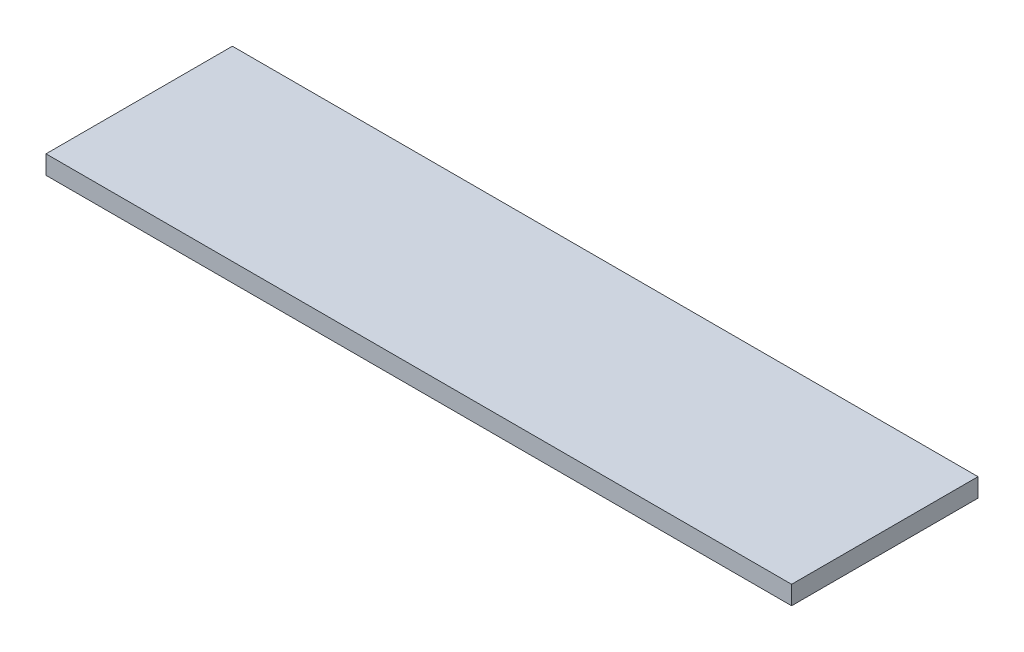
ISO-10303-21;
HEADER;
FILE_DESCRIPTION(('STEP AP214'),'2;1');
FILE_NAME('part.step','',(''),(''),'','','');
FILE_SCHEMA(('AUTOMOTIVE_DESIGN { 1 0 10303 214 1 1 1 1 }'));
ENDSEC;
DATA;
#1=APPLICATION_CONTEXT('core data for automotive mechanical design processes');
#2=APPLICATION_PROTOCOL_DEFINITION('international standard','automotive_design',2000,#1);
#3=PRODUCT_CONTEXT('',#1,'mechanical');
#4=PRODUCT('Part','Part','',(#3));
#5=PRODUCT_RELATED_PRODUCT_CATEGORY('part','',(#4));
#6=PRODUCT_DEFINITION_FORMATION('','',#4);
#7=PRODUCT_DEFINITION_CONTEXT('part definition',#1,'design');
#8=PRODUCT_DEFINITION('design','',#6,#7);
#9=PRODUCT_DEFINITION_SHAPE('','',#8);
#10=(LENGTH_UNIT() NAMED_UNIT(*) SI_UNIT(.MILLI.,.METRE.));
#11=(NAMED_UNIT(*) PLANE_ANGLE_UNIT() SI_UNIT($,.RADIAN.));
#12=(NAMED_UNIT(*) SI_UNIT($,.STERADIAN.) SOLID_ANGLE_UNIT());
#13=UNCERTAINTY_MEASURE_WITH_UNIT(LENGTH_MEASURE(1.E-05),#10,'distance_accuracy_value','');
#14=(GEOMETRIC_REPRESENTATION_CONTEXT(3) GLOBAL_UNCERTAINTY_ASSIGNED_CONTEXT((#13)) GLOBAL_UNIT_ASSIGNED_CONTEXT((#10,
#11,#12)) REPRESENTATION_CONTEXT('',''));
#15=CARTESIAN_POINT('',(0.,0.,0.));
#16=DIRECTION('',(0.,0.,1.));
#17=DIRECTION('',(1.,0.,0.));
#18=AXIS2_PLACEMENT_3D('',#15,#16,#17);
#19=CARTESIAN_POINT('',(200.,10.,-50.));
#20=DIRECTION('',(-1.,0.,0.));
#21=DIRECTION('',(0.,0.,1.));
#22=AXIS2_PLACEMENT_3D('',#19,#20,#21);
#23=PLANE('',#22);
#24=DIRECTION('',(0.,0.,-1.));
#25=VECTOR('',#24,1.);
#26=CARTESIAN_POINT('',(200.,0.,-50.));
#27=LINE('',#26,#25);
#28=CARTESIAN_POINT('',(200.,0.,50.));
#29=VERTEX_POINT('',#28);
#30=CARTESIAN_POINT('',(200.,0.,-50.));
#31=VERTEX_POINT('',#30);
#32=EDGE_CURVE('E107',#29,#31,#27,.T.);
#33=ORIENTED_EDGE('',*,*,#32,.T.);
#34=DIRECTION('',(0.,-1.,0.));
#35=VECTOR('',#34,1.);
#36=CARTESIAN_POINT('',(200.,10.,-50.));
#37=LINE('',#36,#35);
#38=CARTESIAN_POINT('',(200.,10.,-50.));
#39=VERTEX_POINT('',#38);
#40=EDGE_CURVE('E11',#39,#31,#37,.T.);
#41=ORIENTED_EDGE('',*,*,#40,.F.);
#42=DIRECTION('',(0.,0.,-1.));
#43=VECTOR('',#42,1.);
#44=CARTESIAN_POINT('',(200.,10.,-50.));
#45=LINE('',#44,#43);
#46=CARTESIAN_POINT('',(200.,10.,50.));
#47=VERTEX_POINT('',#46);
#48=EDGE_CURVE('E91',#47,#39,#45,.T.);
#49=ORIENTED_EDGE('',*,*,#48,.F.);
#50=DIRECTION('',(0.,-1.,0.));
#51=VECTOR('',#50,1.);
#52=CARTESIAN_POINT('',(200.,10.,50.));
#53=LINE('',#52,#51);
#54=EDGE_CURVE('E103',#47,#29,#53,.T.);
#55=ORIENTED_EDGE('',*,*,#54,.T.);
#56=EDGE_LOOP('',(#33,#41,#49,#55));
#57=FACE_BOUND('',#56,.T.);
#58=ADVANCED_FACE('F39',(#57),#23,.F.);
#59=CARTESIAN_POINT('',(-200.,10.,-50.));
#60=DIRECTION('',(0.,0.,1.));
#61=DIRECTION('',(1.,0.,0.));
#62=AXIS2_PLACEMENT_3D('',#59,#60,#61);
#63=PLANE('',#62);
#64=DIRECTION('',(-1.,0.,0.));
#65=VECTOR('',#64,1.);
#66=CARTESIAN_POINT('',(-200.,0.,-50.));
#67=LINE('',#66,#65);
#68=CARTESIAN_POINT('',(-200.,0.,-50.));
#69=VERTEX_POINT('',#68);
#70=EDGE_CURVE('E96',#31,#69,#67,.T.);
#71=ORIENTED_EDGE('',*,*,#70,.T.);
#72=DIRECTION('',(0.,-1.,0.));
#73=VECTOR('',#72,1.);
#74=CARTESIAN_POINT('',(-200.,10.,-50.));
#75=LINE('',#74,#73);
#76=CARTESIAN_POINT('',(-200.,10.,-50.));
#77=VERTEX_POINT('',#76);
#78=EDGE_CURVE('E48',#77,#69,#75,.T.);
#79=ORIENTED_EDGE('',*,*,#78,.F.);
#80=DIRECTION('',(-1.,0.,0.));
#81=VECTOR('',#80,1.);
#82=CARTESIAN_POINT('',(-200.,10.,-50.));
#83=LINE('',#82,#81);
#84=EDGE_CURVE('E86',#39,#77,#83,.T.);
#85=ORIENTED_EDGE('',*,*,#84,.F.);
#86=ORIENTED_EDGE('',*,*,#40,.T.);
#87=EDGE_LOOP('',(#71,#79,#85,#86));
#88=FACE_BOUND('',#87,.T.);
#89=ADVANCED_FACE('F95',(#88),#63,.F.);
#90=CARTESIAN_POINT('',(-200.,10.,-50.));
#91=DIRECTION('',(1.,0.,0.));
#92=DIRECTION('',(0.,0.,-1.));
#93=AXIS2_PLACEMENT_3D('',#90,#91,#92);
#94=PLANE('',#93);
#95=DIRECTION('',(0.,0.,1.));
#96=VECTOR('',#95,1.);
#97=CARTESIAN_POINT('',(-200.,0.,-50.));
#98=LINE('',#97,#96);
#99=CARTESIAN_POINT('',(-200.,0.,50.));
#100=VERTEX_POINT('',#99);
#101=EDGE_CURVE('E73',#69,#100,#98,.T.);
#102=ORIENTED_EDGE('',*,*,#101,.T.);
#103=DIRECTION('',(0.,-1.,0.));
#104=VECTOR('',#103,1.);
#105=CARTESIAN_POINT('',(-200.,10.,50.));
#106=LINE('',#105,#104);
#107=CARTESIAN_POINT('',(-200.,10.,50.));
#108=VERTEX_POINT('',#107);
#109=EDGE_CURVE('E98',#108,#100,#106,.T.);
#110=ORIENTED_EDGE('',*,*,#109,.F.);
#111=DIRECTION('',(0.,0.,1.));
#112=VECTOR('',#111,1.);
#113=CARTESIAN_POINT('',(-200.,10.,-50.));
#114=LINE('',#113,#112);
#115=EDGE_CURVE('E89',#77,#108,#114,.T.);
#116=ORIENTED_EDGE('',*,*,#115,.F.);
#117=ORIENTED_EDGE('',*,*,#78,.T.);
#118=EDGE_LOOP('',(#102,#110,#116,#117));
#119=FACE_BOUND('',#118,.T.);
#120=ADVANCED_FACE('F99',(#119),#94,.F.);
#121=CARTESIAN_POINT('',(-200.,10.,50.));
#122=DIRECTION('',(0.,0.,-1.));
#123=DIRECTION('',(-1.,0.,0.));
#124=AXIS2_PLACEMENT_3D('',#121,#122,#123);
#125=PLANE('',#124);
#126=DIRECTION('',(1.,0.,0.));
#127=VECTOR('',#126,1.);
#128=CARTESIAN_POINT('',(-200.,0.,50.));
#129=LINE('',#128,#127);
#130=EDGE_CURVE('E79',#100,#29,#129,.T.);
#131=ORIENTED_EDGE('',*,*,#130,.T.);
#132=ORIENTED_EDGE('',*,*,#54,.F.);
#133=DIRECTION('',(1.,0.,0.));
#134=VECTOR('',#133,1.);
#135=CARTESIAN_POINT('',(-200.,10.,50.));
#136=LINE('',#135,#134);
#137=EDGE_CURVE('E56',#108,#47,#136,.T.);
#138=ORIENTED_EDGE('',*,*,#137,.F.);
#139=ORIENTED_EDGE('',*,*,#109,.T.);
#140=EDGE_LOOP('',(#131,#132,#138,#139));
#141=FACE_BOUND('',#140,.T.);
#142=ADVANCED_FACE('F120',(#141),#125,.F.);
#143=CARTESIAN_POINT('',(0.,10.,0.));
#144=DIRECTION('',(0.,1.,0.));
#145=DIRECTION('',(0.,0.,1.));
#146=AXIS2_PLACEMENT_3D('',#143,#144,#145);
#147=PLANE('',#146);
#148=ORIENTED_EDGE('',*,*,#48,.T.);
#149=ORIENTED_EDGE('',*,*,#84,.T.);
#150=ORIENTED_EDGE('',*,*,#115,.T.);
#151=ORIENTED_EDGE('',*,*,#137,.T.);
#152=EDGE_LOOP('',(#148,#149,#150,#151));
#153=FACE_BOUND('',#152,.T.);
#154=ADVANCED_FACE('F87',(#153),#147,.T.);
#155=CARTESIAN_POINT('',(0.,0.,0.));
#156=DIRECTION('',(0.,1.,0.));
#157=DIRECTION('',(0.,0.,1.));
#158=AXIS2_PLACEMENT_3D('',#155,#156,#157);
#159=PLANE('',#158);
#160=ORIENTED_EDGE('',*,*,#32,.F.);
#161=ORIENTED_EDGE('',*,*,#130,.F.);
#162=ORIENTED_EDGE('',*,*,#101,.F.);
#163=ORIENTED_EDGE('',*,*,#70,.F.);
#164=EDGE_LOOP('',(#160,#161,#162,#163));
#165=FACE_BOUND('',#164,.T.);
#166=ADVANCED_FACE('F123',(#165),#159,.F.);
#167=CLOSED_SHELL('',(#58,#89,#120,#142,#154,#166));
#168=MANIFOLD_SOLID_BREP('B2',#167);
#169=ADVANCED_BREP_SHAPE_REPRESENTATION('',(#18,#168),#14);
#170=SHAPE_DEFINITION_REPRESENTATION(#9,#169);
ENDSEC;
END-ISO-10303-21;
